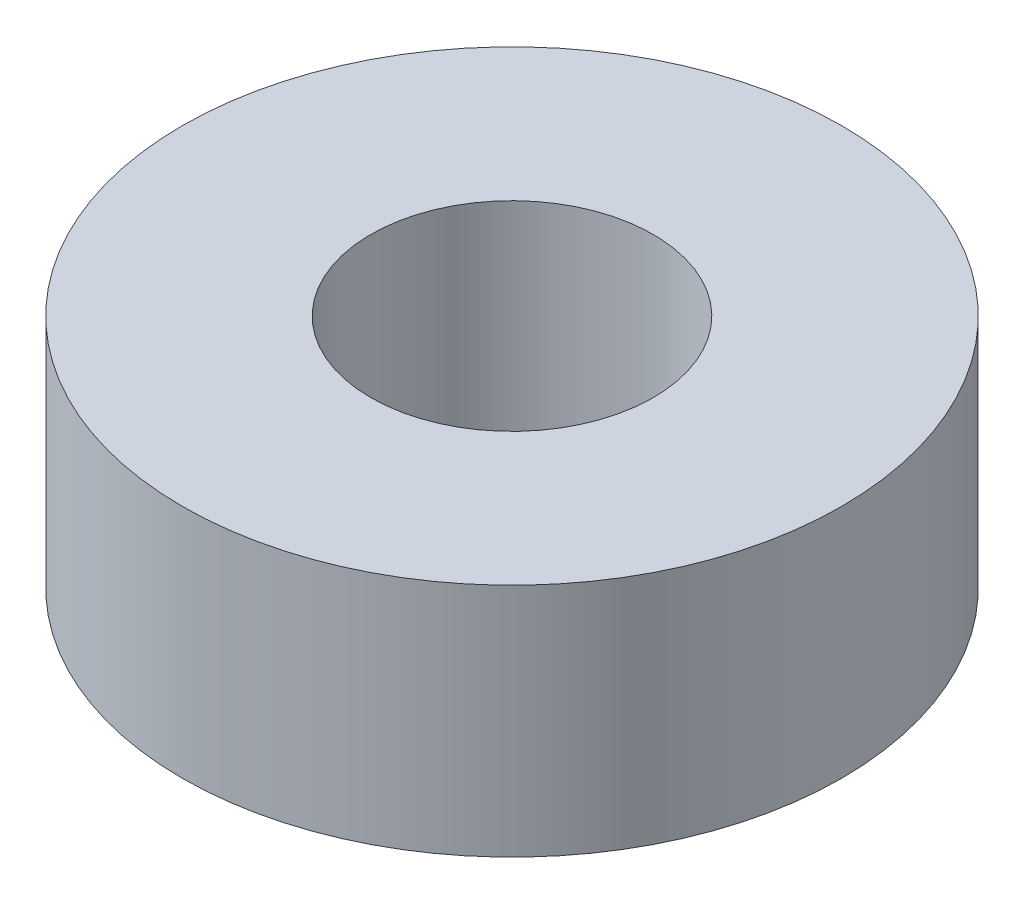
ISO-10303-21;
HEADER;
FILE_DESCRIPTION(('STEP AP214'),'2;1');
FILE_NAME('part.step','',(''),(''),'','','');
FILE_SCHEMA(('AUTOMOTIVE_DESIGN { 1 0 10303 214 1 1 1 1 }'));
ENDSEC;
DATA;
#1=APPLICATION_CONTEXT('core data for automotive mechanical design processes');
#2=APPLICATION_PROTOCOL_DEFINITION('international standard','automotive_design',2000,#1);
#3=PRODUCT_CONTEXT('',#1,'mechanical');
#4=PRODUCT('Part','Part','',(#3));
#5=PRODUCT_RELATED_PRODUCT_CATEGORY('part','',(#4));
#6=PRODUCT_DEFINITION_FORMATION('','',#4);
#7=PRODUCT_DEFINITION_CONTEXT('part definition',#1,'design');
#8=PRODUCT_DEFINITION('design','',#6,#7);
#9=PRODUCT_DEFINITION_SHAPE('','',#8);
#10=(LENGTH_UNIT() NAMED_UNIT(*) SI_UNIT(.MILLI.,.METRE.));
#11=(NAMED_UNIT(*) PLANE_ANGLE_UNIT() SI_UNIT($,.RADIAN.));
#12=(NAMED_UNIT(*) SI_UNIT($,.STERADIAN.) SOLID_ANGLE_UNIT());
#13=UNCERTAINTY_MEASURE_WITH_UNIT(LENGTH_MEASURE(1.E-05),#10,'distance_accuracy_value','');
#14=(GEOMETRIC_REPRESENTATION_CONTEXT(3) GLOBAL_UNCERTAINTY_ASSIGNED_CONTEXT((#13)) GLOBAL_UNIT_ASSIGNED_CONTEXT((#10,
#11,#12)) REPRESENTATION_CONTEXT('',''));
#15=CARTESIAN_POINT('',(0.,0.,0.));
#16=DIRECTION('',(0.,0.,1.));
#17=DIRECTION('',(1.,0.,0.));
#18=AXIS2_PLACEMENT_3D('',#15,#16,#17);
#19=CARTESIAN_POINT('',(0.,5.,0.));
#20=DIRECTION('',(0.,1.,0.));
#21=DIRECTION('',(0.,0.,1.));
#22=AXIS2_PLACEMENT_3D('',#19,#20,#21);
#23=PLANE('',#22);
#24=CARTESIAN_POINT('',(0.,5.,0.));
#25=DIRECTION('',(0.,1.,0.));
#26=DIRECTION('',(0.,0.,1.));
#27=AXIS2_PLACEMENT_3D('',#24,#25,#26);
#28=CIRCLE('',#27,7.);
#29=CARTESIAN_POINT('',(0.,5.,7.));
#30=VERTEX_POINT('',#29);
#31=EDGE_CURVE('E10',#30,#30,#28,.T.);
#32=ORIENTED_EDGE('',*,*,#31,.T.);
#33=EDGE_LOOP('',(#32));
#34=FACE_BOUND('',#33,.T.);
#35=CARTESIAN_POINT('',(0.,5.,0.));
#36=DIRECTION('',(0.,1.,0.));
#37=DIRECTION('',(0.,0.,1.));
#38=AXIS2_PLACEMENT_3D('',#35,#36,#37);
#39=CIRCLE('',#38,3.);
#40=CARTESIAN_POINT('',(0.,5.,3.));
#41=VERTEX_POINT('',#40);
#42=EDGE_CURVE('E42',#41,#41,#39,.T.);
#43=ORIENTED_EDGE('',*,*,#42,.F.);
#44=EDGE_LOOP('',(#43));
#45=FACE_BOUND('',#44,.T.);
#46=ADVANCED_FACE('F31',(#34,#45),#23,.T.);
#47=CARTESIAN_POINT('',(0.,0.,0.));
#48=DIRECTION('',(0.,1.,0.));
#49=DIRECTION('',(0.,0.,1.));
#50=AXIS2_PLACEMENT_3D('',#47,#48,#49);
#51=PLANE('',#50);
#52=CARTESIAN_POINT('',(0.,0.,0.));
#53=DIRECTION('',(0.,1.,0.));
#54=DIRECTION('',(0.,0.,1.));
#55=AXIS2_PLACEMENT_3D('',#52,#53,#54);
#56=CIRCLE('',#55,7.);
#57=CARTESIAN_POINT('',(0.,0.,7.));
#58=VERTEX_POINT('',#57);
#59=EDGE_CURVE('E35',#58,#58,#56,.T.);
#60=ORIENTED_EDGE('',*,*,#59,.F.);
#61=EDGE_LOOP('',(#60));
#62=FACE_BOUND('',#61,.T.);
#63=CARTESIAN_POINT('',(0.,0.,0.));
#64=DIRECTION('',(0.,1.,0.));
#65=DIRECTION('',(0.,0.,1.));
#66=AXIS2_PLACEMENT_3D('',#63,#64,#65);
#67=CIRCLE('',#66,3.);
#68=CARTESIAN_POINT('',(0.,0.,3.));
#69=VERTEX_POINT('',#68);
#70=EDGE_CURVE('E44',#69,#69,#67,.T.);
#71=ORIENTED_EDGE('',*,*,#70,.T.);
#72=EDGE_LOOP('',(#71));
#73=FACE_BOUND('',#72,.T.);
#74=ADVANCED_FACE('F54',(#62,#73),#51,.F.);
#75=CARTESIAN_POINT('',(0.,5.,0.));
#76=DIRECTION('',(0.,-1.,0.));
#77=DIRECTION('',(0.,0.,-1.));
#78=AXIS2_PLACEMENT_3D('',#75,#76,#77);
#79=CYLINDRICAL_SURFACE('',#78,7.);
#80=ORIENTED_EDGE('',*,*,#31,.F.);
#81=EDGE_LOOP('',(#80));
#82=FACE_BOUND('',#81,.T.);
#83=ORIENTED_EDGE('',*,*,#59,.T.);
#84=EDGE_LOOP('',(#83));
#85=FACE_BOUND('',#84,.T.);
#86=ADVANCED_FACE('F33',(#82,#85),#79,.T.);
#87=CARTESIAN_POINT('',(0.,5.,0.));
#88=DIRECTION('',(0.,-1.,0.));
#89=DIRECTION('',(0.,0.,-1.));
#90=AXIS2_PLACEMENT_3D('',#87,#88,#89);
#91=CYLINDRICAL_SURFACE('',#90,3.);
#92=ORIENTED_EDGE('',*,*,#42,.T.);
#93=EDGE_LOOP('',(#92));
#94=FACE_BOUND('',#93,.T.);
#95=ORIENTED_EDGE('',*,*,#70,.F.);
#96=EDGE_LOOP('',(#95));
#97=FACE_BOUND('',#96,.T.);
#98=ADVANCED_FACE('F50',(#94,#97),#91,.F.);
#99=CLOSED_SHELL('',(#46,#74,#86,#98));
#100=MANIFOLD_SOLID_BREP('B2',#99);
#101=ADVANCED_BREP_SHAPE_REPRESENTATION('',(#18,#100),#14);
#102=SHAPE_DEFINITION_REPRESENTATION(#9,#101);
ENDSEC;
END-ISO-10303-21;
